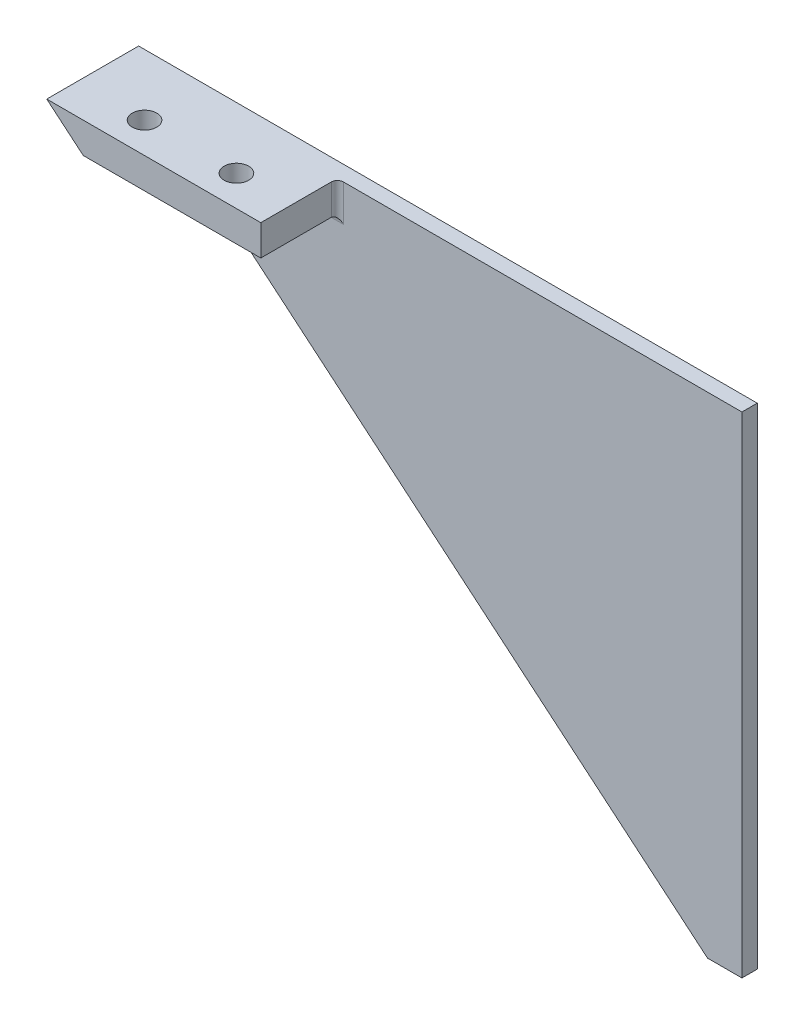
ISO-10303-21;
HEADER;
FILE_DESCRIPTION(('STEP AP214'),'2;1');
FILE_NAME('part.step','',(''),(''),'','','');
FILE_SCHEMA(('AUTOMOTIVE_DESIGN { 1 0 10303 214 1 1 1 1 }'));
ENDSEC;
DATA;
#1=APPLICATION_CONTEXT('core data for automotive mechanical design processes');
#2=APPLICATION_PROTOCOL_DEFINITION('international standard','automotive_design',2000,#1);
#3=PRODUCT_CONTEXT('',#1,'mechanical');
#4=PRODUCT('Part','Part','',(#3));
#5=PRODUCT_RELATED_PRODUCT_CATEGORY('part','',(#4));
#6=PRODUCT_DEFINITION_FORMATION('','',#4);
#7=PRODUCT_DEFINITION_CONTEXT('part definition',#1,'design');
#8=PRODUCT_DEFINITION('design','',#6,#7);
#9=PRODUCT_DEFINITION_SHAPE('','',#8);
#10=(LENGTH_UNIT() NAMED_UNIT(*) SI_UNIT(.MILLI.,.METRE.));
#11=(NAMED_UNIT(*) PLANE_ANGLE_UNIT() SI_UNIT($,.RADIAN.));
#12=(NAMED_UNIT(*) SI_UNIT($,.STERADIAN.) SOLID_ANGLE_UNIT());
#13=UNCERTAINTY_MEASURE_WITH_UNIT(LENGTH_MEASURE(1.E-05),#10,'distance_accuracy_value','');
#14=(GEOMETRIC_REPRESENTATION_CONTEXT(3) GLOBAL_UNCERTAINTY_ASSIGNED_CONTEXT((#13)) GLOBAL_UNIT_ASSIGNED_CONTEXT((#10,
#11,#12)) REPRESENTATION_CONTEXT('',''));
#15=CARTESIAN_POINT('',(0.,0.,0.));
#16=DIRECTION('',(0.,0.,1.));
#17=DIRECTION('',(1.,0.,0.));
#18=AXIS2_PLACEMENT_3D('',#15,#16,#17);
#19=CARTESIAN_POINT('',(0.,0.,5.));
#20=DIRECTION('',(0.,0.,1.));
#21=DIRECTION('',(1.,0.,0.));
#22=AXIS2_PLACEMENT_3D('',#19,#20,#21);
#23=PLANE('',#22);
#24=DIRECTION('',(1.,0.,0.));
#25=VECTOR('',#24,1.);
#26=CARTESIAN_POINT('',(-140.,75.,5.));
#27=LINE('',#26,#25);
#28=CARTESIAN_POINT('',(29.9505669270129,75.,5.));
#29=VERTEX_POINT('',#28);
#30=CARTESIAN_POINT('',(160.,75.,5.));
#31=VERTEX_POINT('',#30);
#32=EDGE_CURVE('E137',#29,#31,#27,.T.);
#33=ORIENTED_EDGE('',*,*,#32,.F.);
#34=DIRECTION('',(0.,-1.,0.));
#35=VECTOR('',#34,1.);
#36=CARTESIAN_POINT('',(29.9505669270129,0.,5.));
#37=LINE('',#36,#35);
#38=CARTESIAN_POINT('',(29.9505669270129,63.,5.));
#39=VERTEX_POINT('',#38);
#40=EDGE_CURVE('E175',#29,#39,#37,.T.);
#41=ORIENTED_EDGE('',*,*,#40,.T.);
#42=DIRECTION('',(-1.,0.,0.));
#43=VECTOR('',#42,1.);
#44=CARTESIAN_POINT('',(0.,63.,5.));
#45=LINE('',#44,#43);
#46=CARTESIAN_POINT('',(-27.6164928148116,63.,5.));
#47=VERTEX_POINT('',#46);
#48=EDGE_CURVE('E59',#39,#47,#45,.T.);
#49=ORIENTED_EDGE('',*,*,#48,.T.);
#50=DIRECTION('',(-0.766044443118977,0.64278760968654,0.));
#51=VECTOR('',#50,1.);
#52=CARTESIAN_POINT('',(19.6109746379007,23.371449478992,5.));
#53=LINE('',#52,#51);
#54=CARTESIAN_POINT('',(148.763038889131,-85.,4.99999999999999));
#55=VERTEX_POINT('',#54);
#56=EDGE_CURVE('E104',#55,#47,#53,.T.);
#57=ORIENTED_EDGE('',*,*,#56,.F.);
#58=DIRECTION('',(-1.,0.,0.));
#59=VECTOR('',#58,1.);
#60=CARTESIAN_POINT('',(160.,-85.,4.99999999999998));
#61=LINE('',#60,#59);
#62=CARTESIAN_POINT('',(160.,-85.,4.99999999999998));
#63=VERTEX_POINT('',#62);
#64=EDGE_CURVE('E109',#63,#55,#61,.T.);
#65=ORIENTED_EDGE('',*,*,#64,.F.);
#66=DIRECTION('',(0.,-1.,0.));
#67=VECTOR('',#66,1.);
#68=CARTESIAN_POINT('',(160.,75.,5.));
#69=LINE('',#68,#67);
#70=EDGE_CURVE('E192',#31,#63,#69,.T.);
#71=ORIENTED_EDGE('',*,*,#70,.F.);
#72=EDGE_LOOP('',(#33,#41,#49,#57,#65,#71));
#73=FACE_BOUND('',#72,.T.);
#74=ADVANCED_FACE('F36',(#73),#23,.T.);
#75=CARTESIAN_POINT('',(-140.,75.,5.));
#76=DIRECTION('',(0.,-1.,0.));
#77=DIRECTION('',(0.,0.,-1.));
#78=AXIS2_PLACEMENT_3D('',#75,#76,#77);
#79=PLANE('',#78);
#80=CARTESIAN_POINT('',(-20.,75.,20.));
#81=DIRECTION('',(0.,-1.,0.));
#82=DIRECTION('',(0.,0.,-1.));
#83=AXIS2_PLACEMENT_3D('',#80,#81,#82);
#84=CIRCLE('',#83,4.);
#85=CARTESIAN_POINT('',(-20.,75.,16.));
#86=VERTEX_POINT('',#85);
#87=EDGE_CURVE('E150',#86,#86,#84,.T.);
#88=ORIENTED_EDGE('',*,*,#87,.T.);
#89=EDGE_LOOP('',(#88));
#90=FACE_BOUND('',#89,.T.);
#91=CARTESIAN_POINT('',(9.99999999999998,75.,20.));
#92=DIRECTION('',(0.,-1.,0.));
#93=DIRECTION('',(0.,0.,-1.));
#94=AXIS2_PLACEMENT_3D('',#91,#92,#93);
#95=CIRCLE('',#94,4.);
#96=CARTESIAN_POINT('',(9.99999999999998,75.,16.));
#97=VERTEX_POINT('',#96);
#98=EDGE_CURVE('E145',#97,#97,#95,.T.);
#99=ORIENTED_EDGE('',*,*,#98,.T.);
#100=EDGE_LOOP('',(#99));
#101=FACE_BOUND('',#100,.T.);
#102=DIRECTION('',(1.,0.,0.));
#103=VECTOR('',#102,1.);
#104=CARTESIAN_POINT('',(-140.,75.,30.));
#105=LINE('',#104,#103);
#106=CARTESIAN_POINT('',(-41.9175359259421,75.,30.));
#107=VERTEX_POINT('',#106);
#108=CARTESIAN_POINT('',(27.9505669270129,75.,30.));
#109=VERTEX_POINT('',#108);
#110=EDGE_CURVE('E158',#107,#109,#105,.T.);
#111=ORIENTED_EDGE('',*,*,#110,.T.);
#112=DIRECTION('',(0.,0.,-1.));
#113=VECTOR('',#112,1.);
#114=CARTESIAN_POINT('',(27.9505669270129,75.,5.00000000000002));
#115=LINE('',#114,#113);
#116=CARTESIAN_POINT('',(27.9505669270129,75.,7.));
#117=VERTEX_POINT('',#116);
#118=EDGE_CURVE('E139',#109,#117,#115,.T.);
#119=ORIENTED_EDGE('',*,*,#118,.T.);
#120=CARTESIAN_POINT('',(29.9505669270129,75.,7.));
#121=DIRECTION('',(0.,-1.,0.));
#122=DIRECTION('',(0.,0.,-1.));
#123=AXIS2_PLACEMENT_3D('',#120,#121,#122);
#124=CIRCLE('',#123,2.);
#125=EDGE_CURVE('E11',#117,#29,#124,.T.);
#126=ORIENTED_EDGE('',*,*,#125,.T.);
#127=ORIENTED_EDGE('',*,*,#32,.T.);
#128=DIRECTION('',(0.,0.,1.));
#129=VECTOR('',#128,1.);
#130=CARTESIAN_POINT('',(160.,75.,5.));
#131=LINE('',#130,#129);
#132=CARTESIAN_POINT('',(160.,75.,0.));
#133=VERTEX_POINT('',#132);
#134=EDGE_CURVE('E132',#133,#31,#131,.T.);
#135=ORIENTED_EDGE('',*,*,#134,.F.);
#136=DIRECTION('',(-1.,0.,0.));
#137=VECTOR('',#136,1.);
#138=CARTESIAN_POINT('',(-140.,75.,0.));
#139=LINE('',#138,#137);
#140=CARTESIAN_POINT('',(-41.9175359259421,75.,0.));
#141=VERTEX_POINT('',#140);
#142=EDGE_CURVE('E162',#133,#141,#139,.T.);
#143=ORIENTED_EDGE('',*,*,#142,.T.);
#144=DIRECTION('',(0.,0.,1.));
#145=VECTOR('',#144,1.);
#146=CARTESIAN_POINT('',(-41.9175359259421,75.,5.));
#147=LINE('',#146,#145);
#148=EDGE_CURVE('E113',#141,#107,#147,.T.);
#149=ORIENTED_EDGE('',*,*,#148,.T.);
#150=EDGE_LOOP('',(#111,#119,#126,#127,#135,#143,#149));
#151=FACE_BOUND('',#150,.T.);
#152=ADVANCED_FACE('F189',(#90,#101,#151),#79,.F.);
#153=CARTESIAN_POINT('',(0.,0.,0.));
#154=DIRECTION('',(0.,0.,1.));
#155=DIRECTION('',(1.,0.,0.));
#156=AXIS2_PLACEMENT_3D('',#153,#154,#155);
#157=PLANE('',#156);
#158=DIRECTION('',(-1.,0.,0.));
#159=VECTOR('',#158,1.);
#160=CARTESIAN_POINT('',(160.,-85.,0.));
#161=LINE('',#160,#159);
#162=CARTESIAN_POINT('',(160.,-85.,0.));
#163=VERTEX_POINT('',#162);
#164=CARTESIAN_POINT('',(148.763038889131,-85.,0.));
#165=VERTEX_POINT('',#164);
#166=EDGE_CURVE('E128',#163,#165,#161,.T.);
#167=ORIENTED_EDGE('',*,*,#166,.T.);
#168=DIRECTION('',(-0.766044443118977,0.64278760968654,0.));
#169=VECTOR('',#168,1.);
#170=CARTESIAN_POINT('',(19.6109746379007,23.371449478992,0.));
#171=LINE('',#170,#169);
#172=EDGE_CURVE('E112',#165,#141,#171,.T.);
#173=ORIENTED_EDGE('',*,*,#172,.T.);
#174=ORIENTED_EDGE('',*,*,#142,.F.);
#175=DIRECTION('',(0.,1.,0.));
#176=VECTOR('',#175,1.);
#177=CARTESIAN_POINT('',(160.,75.,0.));
#178=LINE('',#177,#176);
#179=EDGE_CURVE('E195',#163,#133,#178,.T.);
#180=ORIENTED_EDGE('',*,*,#179,.F.);
#181=EDGE_LOOP('',(#167,#173,#174,#180));
#182=FACE_BOUND('',#181,.T.);
#183=ADVANCED_FACE('F203',(#182),#157,.F.);
#184=CARTESIAN_POINT('',(-140.,65.,30.));
#185=DIRECTION('',(0.,0.,1.));
#186=DIRECTION('',(1.,0.,0.));
#187=AXIS2_PLACEMENT_3D('',#184,#185,#186);
#188=PLANE('',#187);
#189=DIRECTION('',(0.,-1.,0.));
#190=VECTOR('',#189,1.);
#191=CARTESIAN_POINT('',(27.9505669270129,1065.,30.));
#192=LINE('',#191,#190);
#193=CARTESIAN_POINT('',(27.9505669270129,65.,30.));
#194=VERTEX_POINT('',#193);
#195=EDGE_CURVE('E130',#109,#194,#192,.T.);
#196=ORIENTED_EDGE('',*,*,#195,.F.);
#197=ORIENTED_EDGE('',*,*,#110,.F.);
#198=DIRECTION('',(-0.766044443118977,0.64278760968654,0.));
#199=VECTOR('',#198,1.);
#200=CARTESIAN_POINT('',(-94.550649771681,119.164426415671,30.));
#201=LINE('',#200,#199);
#202=CARTESIAN_POINT('',(-30.,65.,30.));
#203=VERTEX_POINT('',#202);
#204=EDGE_CURVE('E153',#203,#107,#201,.T.);
#205=ORIENTED_EDGE('',*,*,#204,.F.);
#206=DIRECTION('',(1.,0.,0.));
#207=VECTOR('',#206,1.);
#208=CARTESIAN_POINT('',(-140.,65.,30.));
#209=LINE('',#208,#207);
#210=EDGE_CURVE('E159',#203,#194,#209,.T.);
#211=ORIENTED_EDGE('',*,*,#210,.T.);
#212=EDGE_LOOP('',(#196,#197,#205,#211));
#213=FACE_BOUND('',#212,.T.);
#214=ADVANCED_FACE('F205',(#213),#188,.T.);
#215=CARTESIAN_POINT('',(0.,65.,0.));
#216=DIRECTION('',(0.,1.,0.));
#217=DIRECTION('',(0.,0.,1.));
#218=AXIS2_PLACEMENT_3D('',#215,#216,#217);
#219=PLANE('',#218);
#220=CARTESIAN_POINT('',(-20.,65.,20.));
#221=DIRECTION('',(0.,-1.,0.));
#222=DIRECTION('',(0.,0.,-1.));
#223=AXIS2_PLACEMENT_3D('',#220,#221,#222);
#224=CIRCLE('',#223,4.);
#225=CARTESIAN_POINT('',(-20.,65.,16.));
#226=VERTEX_POINT('',#225);
#227=EDGE_CURVE('E142',#226,#226,#224,.T.);
#228=ORIENTED_EDGE('',*,*,#227,.F.);
#229=EDGE_LOOP('',(#228));
#230=FACE_BOUND('',#229,.T.);
#231=CARTESIAN_POINT('',(9.99999999999998,65.,20.));
#232=DIRECTION('',(0.,-1.,0.));
#233=DIRECTION('',(0.,0.,-1.));
#234=AXIS2_PLACEMENT_3D('',#231,#232,#233);
#235=CIRCLE('',#234,4.);
#236=CARTESIAN_POINT('',(9.99999999999998,65.,16.));
#237=VERTEX_POINT('',#236);
#238=EDGE_CURVE('E141',#237,#237,#235,.T.);
#239=ORIENTED_EDGE('',*,*,#238,.F.);
#240=EDGE_LOOP('',(#239));
#241=FACE_BOUND('',#240,.T.);
#242=DIRECTION('',(0.,0.,-1.));
#243=VECTOR('',#242,1.);
#244=CARTESIAN_POINT('',(-30.,65.,0.));
#245=LINE('',#244,#243);
#246=CARTESIAN_POINT('',(-30.,65.,7.));
#247=VERTEX_POINT('',#246);
#248=EDGE_CURVE('E122',#203,#247,#245,.T.);
#249=ORIENTED_EDGE('',*,*,#248,.T.);
#250=DIRECTION('',(-1.,0.,0.));
#251=VECTOR('',#250,1.);
#252=CARTESIAN_POINT('',(0.,65.,7.));
#253=LINE('',#252,#251);
#254=CARTESIAN_POINT('',(27.9505669270129,65.,7.));
#255=VERTEX_POINT('',#254);
#256=EDGE_CURVE('E170',#247,#255,#253,.F.);
#257=ORIENTED_EDGE('',*,*,#256,.T.);
#258=DIRECTION('',(0.,0.,-1.));
#259=VECTOR('',#258,1.);
#260=CARTESIAN_POINT('',(27.9505669270129,65.,30.));
#261=LINE('',#260,#259);
#262=EDGE_CURVE('E127',#194,#255,#261,.T.);
#263=ORIENTED_EDGE('',*,*,#262,.F.);
#264=ORIENTED_EDGE('',*,*,#210,.F.);
#265=EDGE_LOOP('',(#249,#257,#263,#264));
#266=FACE_BOUND('',#265,.T.);
#267=ADVANCED_FACE('F183',(#230,#241,#266),#219,.F.);
#268=CARTESIAN_POINT('',(-30.,65.,-495.));
#269=DIRECTION('',(0.64278760968654,0.766044443118977,0.));
#270=DIRECTION('',(-0.766044443118977,0.64278760968654,0.));
#271=AXIS2_PLACEMENT_3D('',#268,#269,#270);
#272=PLANE('',#271);
#273=ORIENTED_EDGE('',*,*,#56,.T.);
#274=CARTESIAN_POINT('',(-27.6164928148116,63.,7.));
#275=DIRECTION('',(0.64278760968654,0.766044443118977,0.));
#276=DIRECTION('',(-0.766044443118977,0.64278760968654,0.));
#277=AXIS2_PLACEMENT_3D('',#274,#275,#276);
#278=ELLIPSE('',#277,3.11144765372082,2.);
#279=EDGE_CURVE('E173',#47,#247,#278,.T.);
#280=ORIENTED_EDGE('',*,*,#279,.T.);
#281=ORIENTED_EDGE('',*,*,#248,.F.);
#282=ORIENTED_EDGE('',*,*,#204,.T.);
#283=ORIENTED_EDGE('',*,*,#148,.F.);
#284=ORIENTED_EDGE('',*,*,#172,.F.);
#285=DIRECTION('',(0.,0.,-1.));
#286=VECTOR('',#285,1.);
#287=CARTESIAN_POINT('',(148.763038889131,-85.,4.99999999999998));
#288=LINE('',#287,#286);
#289=EDGE_CURVE('E116',#55,#165,#288,.T.);
#290=ORIENTED_EDGE('',*,*,#289,.F.);
#291=EDGE_LOOP('',(#273,#280,#281,#282,#283,#284,#290));
#292=FACE_BOUND('',#291,.T.);
#293=ADVANCED_FACE('F117',(#292),#272,.F.);
#294=CARTESIAN_POINT('',(9.99999999999998,1065.,20.));
#295=DIRECTION('',(0.,-1.,0.));
#296=DIRECTION('',(0.,0.,-1.));
#297=AXIS2_PLACEMENT_3D('',#294,#295,#296);
#298=CYLINDRICAL_SURFACE('',#297,4.);
#299=ORIENTED_EDGE('',*,*,#238,.T.);
#300=EDGE_LOOP('',(#299));
#301=FACE_BOUND('',#300,.T.);
#302=ORIENTED_EDGE('',*,*,#98,.F.);
#303=EDGE_LOOP('',(#302));
#304=FACE_BOUND('',#303,.T.);
#305=ADVANCED_FACE('F225',(#301,#304),#298,.F.);
#306=CARTESIAN_POINT('',(-20.,1065.,20.));
#307=DIRECTION('',(0.,-1.,0.));
#308=DIRECTION('',(0.,0.,-1.));
#309=AXIS2_PLACEMENT_3D('',#306,#307,#308);
#310=CYLINDRICAL_SURFACE('',#309,4.);
#311=ORIENTED_EDGE('',*,*,#227,.T.);
#312=EDGE_LOOP('',(#311));
#313=FACE_BOUND('',#312,.T.);
#314=ORIENTED_EDGE('',*,*,#87,.F.);
#315=EDGE_LOOP('',(#314));
#316=FACE_BOUND('',#315,.T.);
#317=ADVANCED_FACE('F228',(#313,#316),#310,.F.);
#318=CARTESIAN_POINT('',(27.9505669270129,1065.,30.));
#319=DIRECTION('',(-1.,0.,0.));
#320=DIRECTION('',(0.,0.,1.));
#321=AXIS2_PLACEMENT_3D('',#318,#319,#320);
#322=PLANE('',#321);
#323=ORIENTED_EDGE('',*,*,#262,.T.);
#324=DIRECTION('',(0.,-1.,0.));
#325=VECTOR('',#324,1.);
#326=CARTESIAN_POINT('',(27.9505669270129,1065.,7.));
#327=LINE('',#326,#325);
#328=EDGE_CURVE('E51',#255,#117,#327,.F.);
#329=ORIENTED_EDGE('',*,*,#328,.T.);
#330=ORIENTED_EDGE('',*,*,#118,.F.);
#331=ORIENTED_EDGE('',*,*,#195,.T.);
#332=EDGE_LOOP('',(#323,#329,#330,#331));
#333=FACE_BOUND('',#332,.T.);
#334=ADVANCED_FACE('F185',(#333),#322,.F.);
#335=CARTESIAN_POINT('',(160.,-85.,4.99999999999998));
#336=DIRECTION('',(0.,1.,0.));
#337=DIRECTION('',(0.,0.,1.));
#338=AXIS2_PLACEMENT_3D('',#335,#336,#337);
#339=PLANE('',#338);
#340=ORIENTED_EDGE('',*,*,#64,.T.);
#341=ORIENTED_EDGE('',*,*,#289,.T.);
#342=ORIENTED_EDGE('',*,*,#166,.F.);
#343=DIRECTION('',(0.,0.,-1.));
#344=VECTOR('',#343,1.);
#345=CARTESIAN_POINT('',(160.,-85.,4.99999999999998));
#346=LINE('',#345,#344);
#347=EDGE_CURVE('E125',#63,#163,#346,.T.);
#348=ORIENTED_EDGE('',*,*,#347,.F.);
#349=EDGE_LOOP('',(#340,#341,#342,#348));
#350=FACE_BOUND('',#349,.T.);
#351=ADVANCED_FACE('F124',(#350),#339,.F.);
#352=CARTESIAN_POINT('',(160.,0.,0.));
#353=DIRECTION('',(1.,0.,0.));
#354=DIRECTION('',(0.,0.,-1.));
#355=AXIS2_PLACEMENT_3D('',#352,#353,#354);
#356=PLANE('',#355);
#357=ORIENTED_EDGE('',*,*,#70,.T.);
#358=ORIENTED_EDGE('',*,*,#347,.T.);
#359=ORIENTED_EDGE('',*,*,#179,.T.);
#360=ORIENTED_EDGE('',*,*,#134,.T.);
#361=EDGE_LOOP('',(#357,#358,#359,#360));
#362=FACE_BOUND('',#361,.T.);
#363=ADVANCED_FACE('F199',(#362),#356,.T.);
#364=CARTESIAN_POINT('',(0.,63.,7.));
#365=DIRECTION('',(-1.,0.,0.));
#366=DIRECTION('',(0.,0.,1.));
#367=AXIS2_PLACEMENT_3D('',#364,#365,#366);
#368=CYLINDRICAL_SURFACE('',#367,2.);
#369=ORIENTED_EDGE('',*,*,#48,.F.);
#370=CARTESIAN_POINT('',(29.9505669270129,63.,7.));
#371=DIRECTION('',(-0.707106781186547,-0.707106781186547,0.));
#372=DIRECTION('',(-0.707106781186547,0.707106781186547,0.));
#373=AXIS2_PLACEMENT_3D('',#370,#371,#372);
#374=ELLIPSE('',#373,2.82842712474619,2.);
#375=EDGE_CURVE('E44',#39,#255,#374,.F.);
#376=ORIENTED_EDGE('',*,*,#375,.T.);
#377=ORIENTED_EDGE('',*,*,#256,.F.);
#378=ORIENTED_EDGE('',*,*,#279,.F.);
#379=EDGE_LOOP('',(#369,#376,#377,#378));
#380=FACE_BOUND('',#379,.T.);
#381=ADVANCED_FACE('F178',(#380),#368,.F.);
#382=CARTESIAN_POINT('',(29.9505669270129,0.,7.));
#383=DIRECTION('',(0.,-1.,0.));
#384=DIRECTION('',(0.,0.,-1.));
#385=AXIS2_PLACEMENT_3D('',#382,#383,#384);
#386=CYLINDRICAL_SURFACE('',#385,2.);
#387=ORIENTED_EDGE('',*,*,#125,.F.);
#388=ORIENTED_EDGE('',*,*,#328,.F.);
#389=ORIENTED_EDGE('',*,*,#375,.F.);
#390=ORIENTED_EDGE('',*,*,#40,.F.);
#391=EDGE_LOOP('',(#387,#388,#389,#390));
#392=FACE_BOUND('',#391,.T.);
#393=ADVANCED_FACE('F38',(#392),#386,.F.);
#394=CLOSED_SHELL('',(#74,#152,#183,#214,#267,#293,#305,#317,#334,#351,#363,#381,#393));
#395=MANIFOLD_SOLID_BREP('B2',#394);
#396=ADVANCED_BREP_SHAPE_REPRESENTATION('',(#18,#395),#14);
#397=SHAPE_DEFINITION_REPRESENTATION(#9,#396);
ENDSEC;
END-ISO-10303-21;
